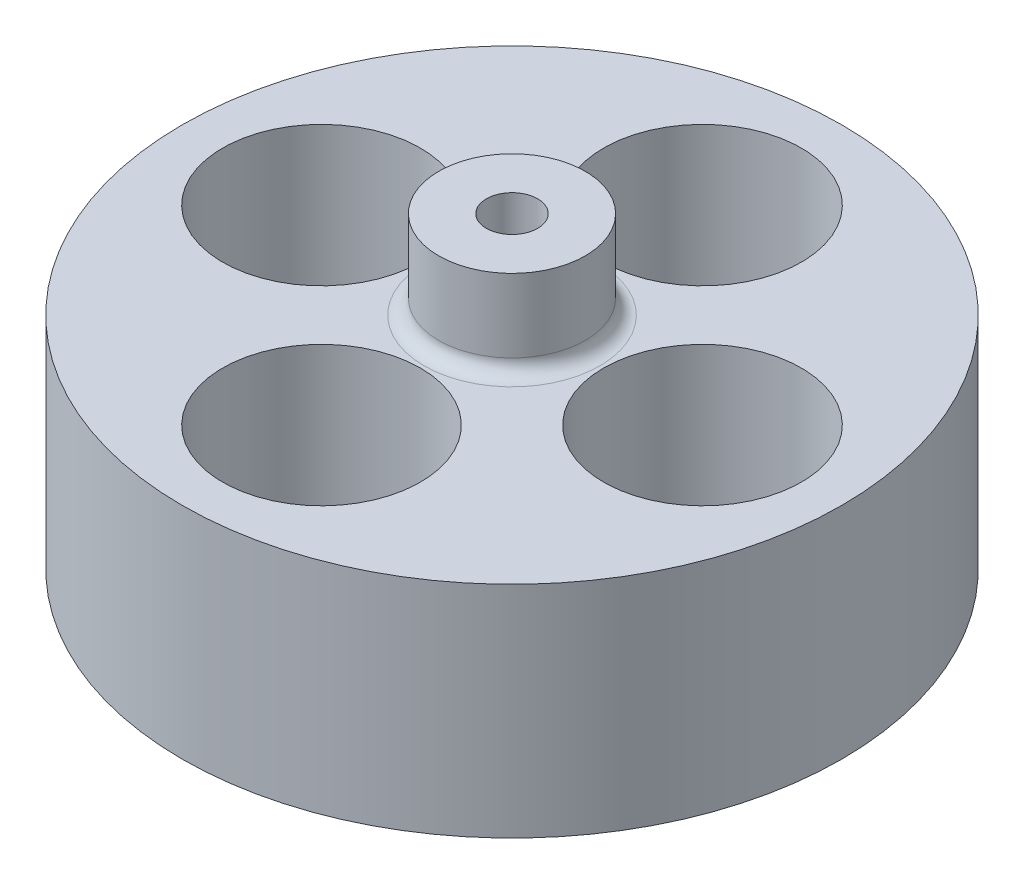
ISO-10303-21;
HEADER;
FILE_DESCRIPTION(('STEP AP214'),'2;1');
FILE_NAME('part.step','',(''),(''),'','','');
FILE_SCHEMA(('AUTOMOTIVE_DESIGN { 1 0 10303 214 1 1 1 1 }'));
ENDSEC;
DATA;
#1=APPLICATION_CONTEXT('core data for automotive mechanical design processes');
#2=APPLICATION_PROTOCOL_DEFINITION('international standard','automotive_design',2000,#1);
#3=PRODUCT_CONTEXT('',#1,'mechanical');
#4=PRODUCT('Part','Part','',(#3));
#5=PRODUCT_RELATED_PRODUCT_CATEGORY('part','',(#4));
#6=PRODUCT_DEFINITION_FORMATION('','',#4);
#7=PRODUCT_DEFINITION_CONTEXT('part definition',#1,'design');
#8=PRODUCT_DEFINITION('design','',#6,#7);
#9=PRODUCT_DEFINITION_SHAPE('','',#8);
#10=(LENGTH_UNIT() NAMED_UNIT(*) SI_UNIT(.MILLI.,.METRE.));
#11=(NAMED_UNIT(*) PLANE_ANGLE_UNIT() SI_UNIT($,.RADIAN.));
#12=(NAMED_UNIT(*) SI_UNIT($,.STERADIAN.) SOLID_ANGLE_UNIT());
#13=UNCERTAINTY_MEASURE_WITH_UNIT(LENGTH_MEASURE(1.E-05),#10,'distance_accuracy_value','');
#14=(GEOMETRIC_REPRESENTATION_CONTEXT(3) GLOBAL_UNCERTAINTY_ASSIGNED_CONTEXT((#13)) GLOBAL_UNIT_ASSIGNED_CONTEXT((#10,
#11,#12)) REPRESENTATION_CONTEXT('',''));
#15=CARTESIAN_POINT('',(0.,0.,0.));
#16=DIRECTION('',(0.,0.,1.));
#17=DIRECTION('',(1.,0.,0.));
#18=AXIS2_PLACEMENT_3D('',#15,#16,#17);
#19=CARTESIAN_POINT('',(0.,-30.,0.));
#20=DIRECTION('',(0.,1.,0.));
#21=DIRECTION('',(0.,0.,1.));
#22=AXIS2_PLACEMENT_3D('',#19,#20,#21);
#23=CYLINDRICAL_SURFACE('',#22,1.75);
#24=CARTESIAN_POINT('',(0.,21.,0.));
#25=DIRECTION('',(0.,1.,0.));
#26=DIRECTION('',(0.,0.,1.));
#27=AXIS2_PLACEMENT_3D('',#24,#25,#26);
#28=CIRCLE('',#27,1.75);
#29=CARTESIAN_POINT('',(0.,21.,1.75));
#30=VERTEX_POINT('',#29);
#31=EDGE_CURVE('E101',#30,#30,#28,.T.);
#32=CARTESIAN_POINT('',(0.,5.,0.));
#33=DIRECTION('',(0.,-1.,0.));
#34=DIRECTION('',(0.,0.,-1.));
#35=AXIS2_PLACEMENT_3D('',#32,#33,#34);
#36=CIRCLE('',#35,1.75);
#37=CARTESIAN_POINT('',(0.,5.,1.75));
#38=VERTEX_POINT('',#37);
#39=EDGE_CURVE('E34',#38,#38,#36,.F.);
#40=CARTESIAN_POINT('',(0.,21.,1.75));
#41=CARTESIAN_POINT('',(0.,20.8333333333333,1.75));
#42=CARTESIAN_POINT('',(0.,20.6666666666667,1.75));
#43=CARTESIAN_POINT('',(0.,20.3333333333333,1.75));
#44=CARTESIAN_POINT('',(0.,20.1666666666667,1.75));
#45=CARTESIAN_POINT('',(0.,19.8333333333333,1.75));
#46=CARTESIAN_POINT('',(0.,19.6666666666667,1.75));
#47=CARTESIAN_POINT('',(0.,19.3333333333333,1.75));
#48=CARTESIAN_POINT('',(0.,19.1666666666667,1.75));
#49=CARTESIAN_POINT('',(0.,18.8333333333333,1.75));
#50=CARTESIAN_POINT('',(0.,18.6666666666667,1.75));
#51=CARTESIAN_POINT('',(0.,18.3333333333333,1.75));
#52=CARTESIAN_POINT('',(0.,18.1666666666667,1.75));
#53=CARTESIAN_POINT('',(0.,17.8333333333333,1.75));
#54=CARTESIAN_POINT('',(0.,17.6666666666667,1.75));
#55=CARTESIAN_POINT('',(0.,17.3333333333333,1.75));
#56=CARTESIAN_POINT('',(0.,17.1666666666667,1.75));
#57=CARTESIAN_POINT('',(0.,16.8333333333333,1.75));
#58=CARTESIAN_POINT('',(0.,16.6666666666667,1.75));
#59=CARTESIAN_POINT('',(0.,16.3333333333333,1.75));
#60=CARTESIAN_POINT('',(0.,16.1666666666667,1.75));
#61=CARTESIAN_POINT('',(0.,15.8333333333333,1.75));
#62=CARTESIAN_POINT('',(0.,15.6666666666667,1.75));
#63=CARTESIAN_POINT('',(0.,15.3333333333333,1.75));
#64=CARTESIAN_POINT('',(0.,15.1666666666667,1.75));
#65=CARTESIAN_POINT('',(0.,14.8333333333333,1.75));
#66=CARTESIAN_POINT('',(0.,14.6666666666667,1.75));
#67=CARTESIAN_POINT('',(0.,14.3333333333333,1.75));
#68=CARTESIAN_POINT('',(0.,14.1666666666667,1.75));
#69=CARTESIAN_POINT('',(0.,13.8333333333333,1.75));
#70=CARTESIAN_POINT('',(0.,13.6666666666667,1.75));
#71=CARTESIAN_POINT('',(0.,13.3333333333333,1.75));
#72=CARTESIAN_POINT('',(0.,13.1666666666667,1.75));
#73=CARTESIAN_POINT('',(0.,12.8333333333333,1.75));
#74=CARTESIAN_POINT('',(0.,12.6666666666667,1.75));
#75=CARTESIAN_POINT('',(0.,12.3333333333333,1.75));
#76=CARTESIAN_POINT('',(0.,12.1666666666667,1.75));
#77=CARTESIAN_POINT('',(0.,11.8333333333333,1.75));
#78=CARTESIAN_POINT('',(0.,11.6666666666667,1.75));
#79=CARTESIAN_POINT('',(0.,11.3333333333333,1.75));
#80=CARTESIAN_POINT('',(0.,11.1666666666667,1.75));
#81=CARTESIAN_POINT('',(0.,10.8333333333333,1.75));
#82=CARTESIAN_POINT('',(0.,10.6666666666667,1.75));
#83=CARTESIAN_POINT('',(0.,10.3333333333333,1.75));
#84=CARTESIAN_POINT('',(0.,10.1666666666667,1.75));
#85=CARTESIAN_POINT('',(0.,9.83333333333333,1.75));
#86=CARTESIAN_POINT('',(0.,9.66666666666667,1.75));
#87=CARTESIAN_POINT('',(0.,9.33333333333333,1.75));
#88=CARTESIAN_POINT('',(0.,9.16666666666667,1.75));
#89=CARTESIAN_POINT('',(0.,8.83333333333333,1.75));
#90=CARTESIAN_POINT('',(0.,8.66666666666667,1.75));
#91=CARTESIAN_POINT('',(0.,8.33333333333333,1.75));
#92=CARTESIAN_POINT('',(0.,8.16666666666667,1.75));
#93=CARTESIAN_POINT('',(0.,7.83333333333334,1.75));
#94=CARTESIAN_POINT('',(0.,7.66666666666667,1.75));
#95=CARTESIAN_POINT('',(0.,7.33333333333334,1.75));
#96=CARTESIAN_POINT('',(0.,7.16666666666667,1.75));
#97=CARTESIAN_POINT('',(0.,6.83333333333334,1.75));
#98=CARTESIAN_POINT('',(0.,6.66666666666667,1.75));
#99=CARTESIAN_POINT('',(0.,6.33333333333334,1.75));
#100=CARTESIAN_POINT('',(0.,6.16666666666667,1.75));
#101=CARTESIAN_POINT('',(0.,5.83333333333334,1.75));
#102=CARTESIAN_POINT('',(0.,5.66666666666667,1.75));
#103=CARTESIAN_POINT('',(0.,5.33333333333334,1.75));
#104=CARTESIAN_POINT('',(0.,5.16666666666667,1.75));
#105=CARTESIAN_POINT('',(0.,5.,1.75));
#106=B_SPLINE_CURVE_WITH_KNOTS('',3,(#40,#41,#42,#43,#44,#45,#46,#47,#48,#49,#50,#51,#52,#53,
#54,#55,#56,#57,#58,#59,#60,#61,#62,#63,#64,#65,#66,#67,#68,#69,#70,#71,#72,#73,#74,#75,#76,#77,
#78,#79,#80,#81,#82,#83,#84,#85,#86,#87,#88,#89,#90,#91,#92,#93,#94,#95,#96,#97,#98,#99,#100,
#101,#102,#103,#104,#105),.UNSPECIFIED.,.F.,.F.,(4,2,2,2,2,2,2,2,2,2,2,2,2,2,2,2,2,2,2,2,2,2,2,
2,2,2,2,2,2,2,2,2,4),(0.,0.5,1.,1.5,2.,2.5,3.,3.5,4.,4.5,5.,5.5,5.99999999999999,
6.49999999999999,6.99999999999999,7.49999999999999,7.99999999999999,8.49999999999999,
8.99999999999999,9.49999999999999,9.99999999999999,10.5,11.,11.5,12.,12.5,13.,13.5,14.,14.5,15.,
15.5,16.),.UNSPECIFIED.);
#107=EDGE_CURVE('BSEAM30',#30,#38,#106,.T.);
#108=ORIENTED_EDGE('',*,*,#31,.T.);
#109=ORIENTED_EDGE('',*,*,#39,.F.);
#110=ORIENTED_EDGE('',*,*,#107,.T.);
#111=ORIENTED_EDGE('',*,*,#107,.F.);
#112=EDGE_LOOP('',(#108,#110,#109,#111));
#113=FACE_BOUND('',#112,.T.);
#114=ADVANCED_FACE('F30',(#113),#23,.F.);
#115=CARTESIAN_POINT('',(0.,15.,0.));
#116=DIRECTION('',(0.,1.,0.));
#117=DIRECTION('',(0.,0.,1.));
#118=AXIS2_PLACEMENT_3D('',#115,#116,#117);
#119=PLANE('',#118);
#120=CARTESIAN_POINT('',(0.,15.,0.));
#121=DIRECTION('',(0.,1.,0.));
#122=DIRECTION('',(0.,0.,1.));
#123=AXIS2_PLACEMENT_3D('',#120,#121,#122);
#124=CIRCLE('',#123,6.);
#125=CARTESIAN_POINT('',(0.,15.,6.));
#126=VERTEX_POINT('',#125);
#127=EDGE_CURVE('E10',#126,#126,#124,.F.);
#128=ORIENTED_EDGE('',*,*,#127,.T.);
#129=EDGE_LOOP('',(#128));
#130=FACE_BOUND('',#129,.T.);
#131=CARTESIAN_POINT('',(0.,15.,0.));
#132=DIRECTION('',(0.,1.,0.));
#133=DIRECTION('',(0.,0.,1.));
#134=AXIS2_PLACEMENT_3D('',#131,#132,#133);
#135=CIRCLE('',#134,22.5);
#136=CARTESIAN_POINT('',(0.,15.,22.5));
#137=VERTEX_POINT('',#136);
#138=EDGE_CURVE('E42',#137,#137,#135,.T.);
#139=ORIENTED_EDGE('',*,*,#138,.T.);
#140=EDGE_LOOP('',(#139));
#141=FACE_BOUND('',#140,.T.);
#142=CARTESIAN_POINT('',(0.,15.,-13.));
#143=DIRECTION('',(0.,1.,0.));
#144=DIRECTION('',(0.,0.,1.));
#145=AXIS2_PLACEMENT_3D('',#142,#143,#144);
#146=CIRCLE('',#145,6.75);
#147=CARTESIAN_POINT('',(0.,15.,-6.25));
#148=VERTEX_POINT('',#147);
#149=EDGE_CURVE('E51',#148,#148,#146,.T.);
#150=ORIENTED_EDGE('',*,*,#149,.F.);
#151=EDGE_LOOP('',(#150));
#152=FACE_BOUND('',#151,.T.);
#153=CARTESIAN_POINT('',(-13.,15.,0.));
#154=DIRECTION('',(0.,1.,0.));
#155=DIRECTION('',(1.,0.,0.));
#156=AXIS2_PLACEMENT_3D('',#153,#154,#155);
#157=CIRCLE('',#156,6.75);
#158=CARTESIAN_POINT('',(-6.25,15.,0.));
#159=VERTEX_POINT('',#158);
#160=EDGE_CURVE('E63',#159,#159,#157,.T.);
#161=ORIENTED_EDGE('',*,*,#160,.F.);
#162=EDGE_LOOP('',(#161));
#163=FACE_BOUND('',#162,.T.);
#164=CARTESIAN_POINT('',(0.,15.,13.));
#165=DIRECTION('',(0.,1.,0.));
#166=DIRECTION('',(0.,0.,-1.));
#167=AXIS2_PLACEMENT_3D('',#164,#165,#166);
#168=CIRCLE('',#167,6.75);
#169=CARTESIAN_POINT('',(0.,15.,6.25));
#170=VERTEX_POINT('',#169);
#171=EDGE_CURVE('E69',#170,#170,#168,.T.);
#172=ORIENTED_EDGE('',*,*,#171,.F.);
#173=EDGE_LOOP('',(#172));
#174=FACE_BOUND('',#173,.T.);
#175=CARTESIAN_POINT('',(13.,15.,-1.36167772214882E-13));
#176=DIRECTION('',(0.,1.,0.));
#177=DIRECTION('',(-1.,0.,0.));
#178=AXIS2_PLACEMENT_3D('',#175,#176,#177);
#179=CIRCLE('',#178,6.75);
#180=CARTESIAN_POINT('',(6.25,15.,0.));
#181=VERTEX_POINT('',#180);
#182=EDGE_CURVE('E75',#181,#181,#179,.T.);
#183=ORIENTED_EDGE('',*,*,#182,.F.);
#184=EDGE_LOOP('',(#183));
#185=FACE_BOUND('',#184,.T.);
#186=ADVANCED_FACE('F117',(#130,#141,#152,#163,#174,#185),#119,.T.);
#187=CARTESIAN_POINT('',(0.,15.,0.));
#188=DIRECTION('',(0.,-1.,0.));
#189=DIRECTION('',(0.,0.,-1.));
#190=AXIS2_PLACEMENT_3D('',#187,#188,#189);
#191=CYLINDRICAL_SURFACE('',#190,22.5);
#192=ORIENTED_EDGE('',*,*,#138,.F.);
#193=EDGE_LOOP('',(#192));
#194=FACE_BOUND('',#193,.T.);
#195=CARTESIAN_POINT('',(0.,0.,0.));
#196=DIRECTION('',(0.,1.,0.));
#197=DIRECTION('',(0.,0.,1.));
#198=AXIS2_PLACEMENT_3D('',#195,#196,#197);
#199=CIRCLE('',#198,22.5);
#200=CARTESIAN_POINT('',(0.,0.,22.5));
#201=VERTEX_POINT('',#200);
#202=EDGE_CURVE('E45',#201,#201,#199,.T.);
#203=ORIENTED_EDGE('',*,*,#202,.T.);
#204=EDGE_LOOP('',(#203));
#205=FACE_BOUND('',#204,.T.);
#206=ADVANCED_FACE('F123',(#194,#205),#191,.T.);
#207=CARTESIAN_POINT('',(0.,0.,0.));
#208=DIRECTION('',(0.,1.,0.));
#209=DIRECTION('',(0.,0.,1.));
#210=AXIS2_PLACEMENT_3D('',#207,#208,#209);
#211=PLANE('',#210);
#212=CARTESIAN_POINT('',(0.,0.,0.));
#213=DIRECTION('',(0.,-1.,0.));
#214=DIRECTION('',(0.,0.,-1.));
#215=AXIS2_PLACEMENT_3D('',#212,#213,#214);
#216=CIRCLE('',#215,3.5);
#217=CARTESIAN_POINT('',(0.,0.,-3.5));
#218=VERTEX_POINT('',#217);
#219=EDGE_CURVE('E104',#218,#218,#216,.T.);
#220=ORIENTED_EDGE('',*,*,#219,.F.);
#221=EDGE_LOOP('',(#220));
#222=FACE_BOUND('',#221,.T.);
#223=CARTESIAN_POINT('',(13.,0.,-1.36167772214882E-13));
#224=DIRECTION('',(0.,1.,0.));
#225=DIRECTION('',(0.,0.,1.));
#226=AXIS2_PLACEMENT_3D('',#223,#224,#225);
#227=CIRCLE('',#226,2.);
#228=CARTESIAN_POINT('',(13.,0.,1.99999999999987));
#229=VERTEX_POINT('',#228);
#230=EDGE_CURVE('E92',#229,#229,#227,.T.);
#231=ORIENTED_EDGE('',*,*,#230,.T.);
#232=EDGE_LOOP('',(#231));
#233=FACE_BOUND('',#232,.T.);
#234=CARTESIAN_POINT('',(0.,0.,13.));
#235=DIRECTION('',(0.,1.,0.));
#236=DIRECTION('',(0.,0.,1.));
#237=AXIS2_PLACEMENT_3D('',#234,#235,#236);
#238=CIRCLE('',#237,2.);
#239=CARTESIAN_POINT('',(0.,0.,15.));
#240=VERTEX_POINT('',#239);
#241=EDGE_CURVE('E86',#240,#240,#238,.T.);
#242=ORIENTED_EDGE('',*,*,#241,.T.);
#243=EDGE_LOOP('',(#242));
#244=FACE_BOUND('',#243,.T.);
#245=CARTESIAN_POINT('',(-13.,0.,0.));
#246=DIRECTION('',(0.,1.,0.));
#247=DIRECTION('',(0.,0.,1.));
#248=AXIS2_PLACEMENT_3D('',#245,#246,#247);
#249=CIRCLE('',#248,2.);
#250=CARTESIAN_POINT('',(-13.,0.,2.00000000000005));
#251=VERTEX_POINT('',#250);
#252=EDGE_CURVE('E78',#251,#251,#249,.T.);
#253=ORIENTED_EDGE('',*,*,#252,.T.);
#254=EDGE_LOOP('',(#253));
#255=FACE_BOUND('',#254,.T.);
#256=CARTESIAN_POINT('',(0.,0.,-13.));
#257=DIRECTION('',(0.,1.,0.));
#258=DIRECTION('',(0.,0.,1.));
#259=AXIS2_PLACEMENT_3D('',#256,#257,#258);
#260=CIRCLE('',#259,2.);
#261=CARTESIAN_POINT('',(0.,0.,-11.));
#262=VERTEX_POINT('',#261);
#263=EDGE_CURVE('E54',#262,#262,#260,.T.);
#264=ORIENTED_EDGE('',*,*,#263,.T.);
#265=EDGE_LOOP('',(#264));
#266=FACE_BOUND('',#265,.T.);
#267=ORIENTED_EDGE('',*,*,#202,.F.);
#268=EDGE_LOOP('',(#267));
#269=FACE_BOUND('',#268,.T.);
#270=ADVANCED_FACE('F176',(#222,#233,#244,#255,#266,#269),#211,.F.);
#271=CARTESIAN_POINT('',(0.,5.,-13.));
#272=DIRECTION('',(0.,1.,0.));
#273=DIRECTION('',(0.,0.,1.));
#274=AXIS2_PLACEMENT_3D('',#271,#272,#273);
#275=CYLINDRICAL_SURFACE('',#274,6.75);
#276=CARTESIAN_POINT('',(0.,5.,-13.));
#277=DIRECTION('',(0.,1.,0.));
#278=DIRECTION('',(0.,0.,1.));
#279=AXIS2_PLACEMENT_3D('',#276,#277,#278);
#280=CIRCLE('',#279,6.75);
#281=CARTESIAN_POINT('',(0.,5.,-6.25));
#282=VERTEX_POINT('',#281);
#283=EDGE_CURVE('E48',#282,#282,#280,.T.);
#284=ORIENTED_EDGE('',*,*,#283,.F.);
#285=EDGE_LOOP('',(#284));
#286=FACE_BOUND('',#285,.T.);
#287=ORIENTED_EDGE('',*,*,#149,.T.);
#288=EDGE_LOOP('',(#287));
#289=FACE_BOUND('',#288,.T.);
#290=ADVANCED_FACE('F173',(#286,#289),#275,.F.);
#291=CARTESIAN_POINT('',(0.,5.,-13.));
#292=DIRECTION('',(0.,1.,0.));
#293=DIRECTION('',(0.,0.,1.));
#294=AXIS2_PLACEMENT_3D('',#291,#292,#293);
#295=PLANE('',#294);
#296=CARTESIAN_POINT('',(0.,5.,-13.));
#297=DIRECTION('',(0.,1.,0.));
#298=DIRECTION('',(0.,0.,1.));
#299=AXIS2_PLACEMENT_3D('',#296,#297,#298);
#300=CIRCLE('',#299,2.);
#301=CARTESIAN_POINT('',(0.,5.,-11.));
#302=VERTEX_POINT('',#301);
#303=EDGE_CURVE('E59',#302,#302,#300,.T.);
#304=ORIENTED_EDGE('',*,*,#303,.F.);
#305=EDGE_LOOP('',(#304));
#306=FACE_BOUND('',#305,.T.);
#307=ORIENTED_EDGE('',*,*,#283,.T.);
#308=EDGE_LOOP('',(#307));
#309=FACE_BOUND('',#308,.T.);
#310=ADVANCED_FACE('F169',(#306,#309),#295,.T.);
#311=CARTESIAN_POINT('',(0.,-30.,-13.));
#312=DIRECTION('',(0.,1.,0.));
#313=DIRECTION('',(0.,0.,1.));
#314=AXIS2_PLACEMENT_3D('',#311,#312,#313);
#315=CYLINDRICAL_SURFACE('',#314,2.);
#316=ORIENTED_EDGE('',*,*,#303,.T.);
#317=EDGE_LOOP('',(#316));
#318=FACE_BOUND('',#317,.T.);
#319=ORIENTED_EDGE('',*,*,#263,.F.);
#320=EDGE_LOOP('',(#319));
#321=FACE_BOUND('',#320,.T.);
#322=ADVANCED_FACE('F165',(#318,#321),#315,.F.);
#323=CARTESIAN_POINT('',(-13.,5.,0.));
#324=DIRECTION('',(0.,1.,0.));
#325=DIRECTION('',(0.,0.,1.));
#326=AXIS2_PLACEMENT_3D('',#323,#324,#325);
#327=CYLINDRICAL_SURFACE('',#326,6.75);
#328=CARTESIAN_POINT('',(-13.,5.,0.));
#329=DIRECTION('',(0.,1.,0.));
#330=DIRECTION('',(1.,0.,0.));
#331=AXIS2_PLACEMENT_3D('',#328,#329,#330);
#332=CIRCLE('',#331,6.75);
#333=CARTESIAN_POINT('',(-6.25,5.,0.));
#334=VERTEX_POINT('',#333);
#335=EDGE_CURVE('E62',#334,#334,#332,.T.);
#336=ORIENTED_EDGE('',*,*,#335,.F.);
#337=EDGE_LOOP('',(#336));
#338=FACE_BOUND('',#337,.T.);
#339=ORIENTED_EDGE('',*,*,#160,.T.);
#340=EDGE_LOOP('',(#339));
#341=FACE_BOUND('',#340,.T.);
#342=ADVANCED_FACE('F161',(#338,#341),#327,.F.);
#343=CARTESIAN_POINT('',(-13.,5.,0.));
#344=DIRECTION('',(0.,1.,0.));
#345=DIRECTION('',(1.,0.,0.));
#346=AXIS2_PLACEMENT_3D('',#343,#344,#345);
#347=PLANE('',#346);
#348=CARTESIAN_POINT('',(-13.,5.,0.));
#349=DIRECTION('',(0.,1.,0.));
#350=DIRECTION('',(1.,0.,0.));
#351=AXIS2_PLACEMENT_3D('',#348,#349,#350);
#352=CIRCLE('',#351,2.);
#353=CARTESIAN_POINT('',(-11.,5.,0.));
#354=VERTEX_POINT('',#353);
#355=EDGE_CURVE('E83',#354,#354,#352,.T.);
#356=ORIENTED_EDGE('',*,*,#355,.F.);
#357=EDGE_LOOP('',(#356));
#358=FACE_BOUND('',#357,.T.);
#359=ORIENTED_EDGE('',*,*,#335,.T.);
#360=EDGE_LOOP('',(#359));
#361=FACE_BOUND('',#360,.T.);
#362=ADVANCED_FACE('F157',(#358,#361),#347,.T.);
#363=CARTESIAN_POINT('',(0.,5.,13.));
#364=DIRECTION('',(0.,1.,0.));
#365=DIRECTION('',(0.,0.,1.));
#366=AXIS2_PLACEMENT_3D('',#363,#364,#365);
#367=CYLINDRICAL_SURFACE('',#366,6.75);
#368=CARTESIAN_POINT('',(0.,5.,13.));
#369=DIRECTION('',(0.,1.,0.));
#370=DIRECTION('',(0.,0.,-1.));
#371=AXIS2_PLACEMENT_3D('',#368,#369,#370);
#372=CIRCLE('',#371,6.75);
#373=CARTESIAN_POINT('',(0.,5.,6.25));
#374=VERTEX_POINT('',#373);
#375=EDGE_CURVE('E66',#374,#374,#372,.T.);
#376=ORIENTED_EDGE('',*,*,#375,.F.);
#377=EDGE_LOOP('',(#376));
#378=FACE_BOUND('',#377,.T.);
#379=ORIENTED_EDGE('',*,*,#171,.T.);
#380=EDGE_LOOP('',(#379));
#381=FACE_BOUND('',#380,.T.);
#382=ADVANCED_FACE('F153',(#378,#381),#367,.F.);
#383=CARTESIAN_POINT('',(0.,5.,13.));
#384=DIRECTION('',(0.,1.,0.));
#385=DIRECTION('',(0.,0.,-1.));
#386=AXIS2_PLACEMENT_3D('',#383,#384,#385);
#387=PLANE('',#386);
#388=CARTESIAN_POINT('',(0.,5.,13.));
#389=DIRECTION('',(0.,1.,0.));
#390=DIRECTION('',(0.,0.,-1.));
#391=AXIS2_PLACEMENT_3D('',#388,#389,#390);
#392=CIRCLE('',#391,2.);
#393=CARTESIAN_POINT('',(0.,5.,11.));
#394=VERTEX_POINT('',#393);
#395=EDGE_CURVE('E89',#394,#394,#392,.T.);
#396=ORIENTED_EDGE('',*,*,#395,.F.);
#397=EDGE_LOOP('',(#396));
#398=FACE_BOUND('',#397,.T.);
#399=ORIENTED_EDGE('',*,*,#375,.T.);
#400=EDGE_LOOP('',(#399));
#401=FACE_BOUND('',#400,.T.);
#402=ADVANCED_FACE('F149',(#398,#401),#387,.T.);
#403=CARTESIAN_POINT('',(13.,5.,-1.36167772214882E-13));
#404=DIRECTION('',(0.,1.,0.));
#405=DIRECTION('',(0.,0.,1.));
#406=AXIS2_PLACEMENT_3D('',#403,#404,#405);
#407=CYLINDRICAL_SURFACE('',#406,6.75);
#408=CARTESIAN_POINT('',(13.,5.,-1.36167772214882E-13));
#409=DIRECTION('',(0.,1.,0.));
#410=DIRECTION('',(-1.,0.,0.));
#411=AXIS2_PLACEMENT_3D('',#408,#409,#410);
#412=CIRCLE('',#411,6.75);
#413=CARTESIAN_POINT('',(6.25,5.,0.));
#414=VERTEX_POINT('',#413);
#415=EDGE_CURVE('E72',#414,#414,#412,.T.);
#416=ORIENTED_EDGE('',*,*,#415,.F.);
#417=EDGE_LOOP('',(#416));
#418=FACE_BOUND('',#417,.T.);
#419=ORIENTED_EDGE('',*,*,#182,.T.);
#420=EDGE_LOOP('',(#419));
#421=FACE_BOUND('',#420,.T.);
#422=ADVANCED_FACE('F145',(#418,#421),#407,.F.);
#423=CARTESIAN_POINT('',(13.,5.,-1.36167772214882E-13));
#424=DIRECTION('',(0.,1.,0.));
#425=DIRECTION('',(-1.,0.,0.));
#426=AXIS2_PLACEMENT_3D('',#423,#424,#425);
#427=PLANE('',#426);
#428=CARTESIAN_POINT('',(13.,5.,-1.36167772214882E-13));
#429=DIRECTION('',(0.,1.,0.));
#430=DIRECTION('',(-1.,0.,0.));
#431=AXIS2_PLACEMENT_3D('',#428,#429,#430);
#432=CIRCLE('',#431,2.);
#433=CARTESIAN_POINT('',(11.,5.,-1.15218884181823E-13));
#434=VERTEX_POINT('',#433);
#435=EDGE_CURVE('E95',#434,#434,#432,.T.);
#436=ORIENTED_EDGE('',*,*,#435,.F.);
#437=EDGE_LOOP('',(#436));
#438=FACE_BOUND('',#437,.T.);
#439=ORIENTED_EDGE('',*,*,#415,.T.);
#440=EDGE_LOOP('',(#439));
#441=FACE_BOUND('',#440,.T.);
#442=ADVANCED_FACE('F141',(#438,#441),#427,.T.);
#443=CARTESIAN_POINT('',(-13.,-30.,0.));
#444=DIRECTION('',(0.,1.,0.));
#445=DIRECTION('',(0.,0.,1.));
#446=AXIS2_PLACEMENT_3D('',#443,#444,#445);
#447=CYLINDRICAL_SURFACE('',#446,2.);
#448=ORIENTED_EDGE('',*,*,#355,.T.);
#449=EDGE_LOOP('',(#448));
#450=FACE_BOUND('',#449,.T.);
#451=ORIENTED_EDGE('',*,*,#252,.F.);
#452=EDGE_LOOP('',(#451));
#453=FACE_BOUND('',#452,.T.);
#454=ADVANCED_FACE('F137',(#450,#453),#447,.F.);
#455=CARTESIAN_POINT('',(0.,-30.,13.));
#456=DIRECTION('',(0.,1.,0.));
#457=DIRECTION('',(0.,0.,1.));
#458=AXIS2_PLACEMENT_3D('',#455,#456,#457);
#459=CYLINDRICAL_SURFACE('',#458,2.);
#460=ORIENTED_EDGE('',*,*,#395,.T.);
#461=EDGE_LOOP('',(#460));
#462=FACE_BOUND('',#461,.T.);
#463=ORIENTED_EDGE('',*,*,#241,.F.);
#464=EDGE_LOOP('',(#463));
#465=FACE_BOUND('',#464,.T.);
#466=ADVANCED_FACE('F133',(#462,#465),#459,.F.);
#467=CARTESIAN_POINT('',(13.,-30.,-1.36167772214882E-13));
#468=DIRECTION('',(0.,1.,0.));
#469=DIRECTION('',(0.,0.,1.));
#470=AXIS2_PLACEMENT_3D('',#467,#468,#469);
#471=CYLINDRICAL_SURFACE('',#470,2.);
#472=ORIENTED_EDGE('',*,*,#435,.T.);
#473=EDGE_LOOP('',(#472));
#474=FACE_BOUND('',#473,.T.);
#475=ORIENTED_EDGE('',*,*,#230,.F.);
#476=EDGE_LOOP('',(#475));
#477=FACE_BOUND('',#476,.T.);
#478=ADVANCED_FACE('F129',(#474,#477),#471,.F.);
#479=CARTESIAN_POINT('',(0.,21.,0.));
#480=DIRECTION('',(0.,1.,0.));
#481=DIRECTION('',(0.,0.,1.));
#482=AXIS2_PLACEMENT_3D('',#479,#480,#481);
#483=PLANE('',#482);
#484=CARTESIAN_POINT('',(0.,21.,0.));
#485=DIRECTION('',(0.,1.,0.));
#486=DIRECTION('',(0.,0.,1.));
#487=AXIS2_PLACEMENT_3D('',#484,#485,#486);
#488=CIRCLE('',#487,5.);
#489=CARTESIAN_POINT('',(0.,21.,5.));
#490=VERTEX_POINT('',#489);
#491=EDGE_CURVE('E98',#490,#490,#488,.T.);
#492=ORIENTED_EDGE('',*,*,#491,.T.);
#493=EDGE_LOOP('',(#492));
#494=FACE_BOUND('',#493,.T.);
#495=ORIENTED_EDGE('',*,*,#31,.F.);
#496=EDGE_LOOP('',(#495));
#497=FACE_BOUND('',#496,.T.);
#498=ADVANCED_FACE('F132',(#494,#497),#483,.T.);
#499=CARTESIAN_POINT('',(0.,21.,0.));
#500=DIRECTION('',(0.,-1.,0.));
#501=DIRECTION('',(0.,0.,-1.));
#502=AXIS2_PLACEMENT_3D('',#499,#500,#501);
#503=CYLINDRICAL_SURFACE('',#502,5.);
#504=CARTESIAN_POINT('',(0.,16.,0.));
#505=DIRECTION('',(0.,1.,0.));
#506=DIRECTION('',(0.,0.,1.));
#507=AXIS2_PLACEMENT_3D('',#504,#505,#506);
#508=CIRCLE('',#507,5.);
#509=CARTESIAN_POINT('',(0.,16.,5.));
#510=VERTEX_POINT('',#509);
#511=EDGE_CURVE('E38',#510,#510,#508,.T.);
#512=ORIENTED_EDGE('',*,*,#511,.T.);
#513=EDGE_LOOP('',(#512));
#514=FACE_BOUND('',#513,.T.);
#515=ORIENTED_EDGE('',*,*,#491,.F.);
#516=EDGE_LOOP('',(#515));
#517=FACE_BOUND('',#516,.T.);
#518=ADVANCED_FACE('F127',(#514,#517),#503,.T.);
#519=CARTESIAN_POINT('',(0.,16.,0.));
#520=DIRECTION('',(0.,1.,0.));
#521=DIRECTION('',(0.,0.,1.));
#522=AXIS2_PLACEMENT_3D('',#519,#520,#521);
#523=TOROIDAL_SURFACE('',#522,6.,1.);
#524=ORIENTED_EDGE('',*,*,#127,.F.);
#525=EDGE_LOOP('',(#524));
#526=FACE_BOUND('',#525,.T.);
#527=ORIENTED_EDGE('',*,*,#511,.F.);
#528=EDGE_LOOP('',(#527));
#529=FACE_BOUND('',#528,.T.);
#530=ADVANCED_FACE('F32',(#526,#529),#523,.F.);
#531=CARTESIAN_POINT('',(0.,5.,0.));
#532=DIRECTION('',(0.,-1.,0.));
#533=DIRECTION('',(0.,0.,-1.));
#534=AXIS2_PLACEMENT_3D('',#531,#532,#533);
#535=PLANE('',#534);
#536=CARTESIAN_POINT('',(0.,5.,0.));
#537=DIRECTION('',(0.,-1.,0.));
#538=DIRECTION('',(0.,0.,-1.));
#539=AXIS2_PLACEMENT_3D('',#536,#537,#538);
#540=CIRCLE('',#539,3.5);
#541=CARTESIAN_POINT('',(0.,5.,-3.5));
#542=VERTEX_POINT('',#541);
#543=EDGE_CURVE('E107',#542,#542,#540,.T.);
#544=ORIENTED_EDGE('',*,*,#543,.T.);
#545=EDGE_LOOP('',(#544));
#546=FACE_BOUND('',#545,.T.);
#547=ORIENTED_EDGE('',*,*,#39,.T.);
#548=EDGE_LOOP('',(#547));
#549=FACE_BOUND('',#548,.T.);
#550=ADVANCED_FACE('F114',(#546,#549),#535,.T.);
#551=CARTESIAN_POINT('',(0.,5.,0.));
#552=DIRECTION('',(0.,-1.,0.));
#553=DIRECTION('',(0.,0.,-1.));
#554=AXIS2_PLACEMENT_3D('',#551,#552,#553);
#555=CYLINDRICAL_SURFACE('',#554,3.5);
#556=ORIENTED_EDGE('',*,*,#543,.F.);
#557=EDGE_LOOP('',(#556));
#558=FACE_BOUND('',#557,.T.);
#559=ORIENTED_EDGE('',*,*,#219,.T.);
#560=EDGE_LOOP('',(#559));
#561=FACE_BOUND('',#560,.T.);
#562=ADVANCED_FACE('F280',(#558,#561),#555,.F.);
#563=CLOSED_SHELL('',(#114,#186,#206,#270,#290,#310,#322,#342,#362,#382,#402,#422,#442,#454,
#466,#478,#498,#518,#530,#550,#562));
#564=MANIFOLD_SOLID_BREP('B2',#563);
#565=ADVANCED_BREP_SHAPE_REPRESENTATION('',(#18,#564),#14);
#566=SHAPE_DEFINITION_REPRESENTATION(#9,#565);
ENDSEC;
END-ISO-10303-21;
